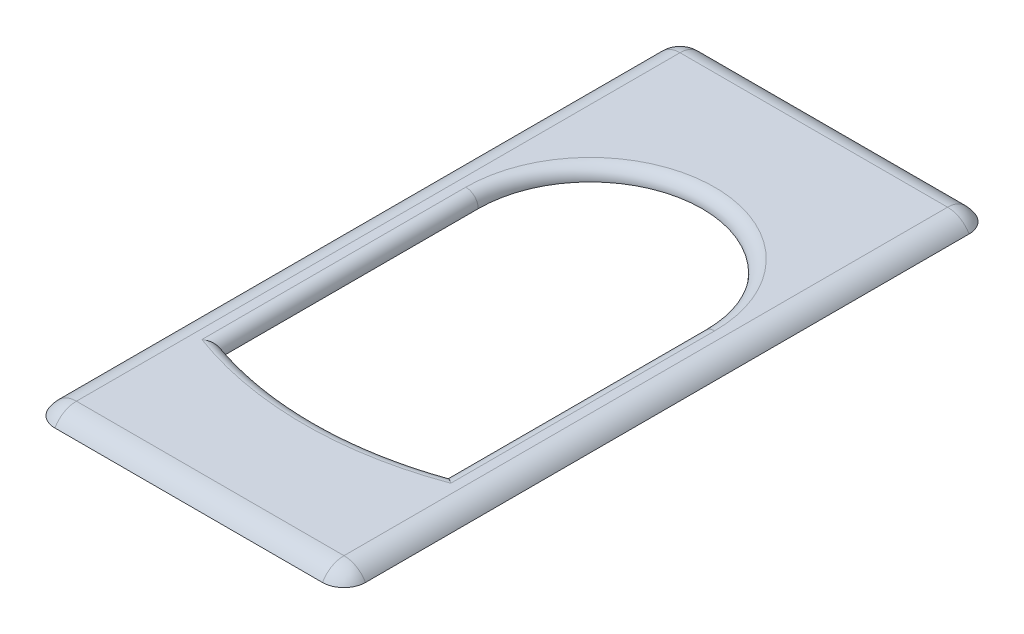
ISO-10303-21;
HEADER;
FILE_DESCRIPTION(('STEP AP214'),'2;1');
FILE_NAME('part.step','',(''),(''),'','','');
FILE_SCHEMA(('AUTOMOTIVE_DESIGN { 1 0 10303 214 1 1 1 1 }'));
ENDSEC;
DATA;
#1=APPLICATION_CONTEXT('core data for automotive mechanical design processes');
#2=APPLICATION_PROTOCOL_DEFINITION('international standard','automotive_design',2000,#1);
#3=PRODUCT_CONTEXT('',#1,'mechanical');
#4=PRODUCT('Part','Part','',(#3));
#5=PRODUCT_RELATED_PRODUCT_CATEGORY('part','',(#4));
#6=PRODUCT_DEFINITION_FORMATION('','',#4);
#7=PRODUCT_DEFINITION_CONTEXT('part definition',#1,'design');
#8=PRODUCT_DEFINITION('design','',#6,#7);
#9=PRODUCT_DEFINITION_SHAPE('','',#8);
#10=(LENGTH_UNIT() NAMED_UNIT(*) SI_UNIT(.MILLI.,.METRE.));
#11=(NAMED_UNIT(*) PLANE_ANGLE_UNIT() SI_UNIT($,.RADIAN.));
#12=(NAMED_UNIT(*) SI_UNIT($,.STERADIAN.) SOLID_ANGLE_UNIT());
#13=UNCERTAINTY_MEASURE_WITH_UNIT(LENGTH_MEASURE(1.E-05),#10,'distance_accuracy_value','');
#14=(GEOMETRIC_REPRESENTATION_CONTEXT(3) GLOBAL_UNCERTAINTY_ASSIGNED_CONTEXT((#13)) GLOBAL_UNIT_ASSIGNED_CONTEXT((#10,
#11,#12)) REPRESENTATION_CONTEXT('',''));
#15=CARTESIAN_POINT('',(0.,0.,0.));
#16=DIRECTION('',(0.,0.,1.));
#17=DIRECTION('',(1.,0.,0.));
#18=AXIS2_PLACEMENT_3D('',#15,#16,#17);
#19=CARTESIAN_POINT('',(-8.35943293347874,2.,-34.0991604019739));
#20=DIRECTION('',(0.,1.,0.));
#21=DIRECTION('',(0.,0.,1.));
#22=AXIS2_PLACEMENT_3D('',#19,#20,#21);
#23=PLANE('',#22);
#24=CARTESIAN_POINT('',(2.39056706652126,2.,-16.1368047982552));
#25=DIRECTION('',(0.,1.,0.));
#26=DIRECTION('',(0.,0.,1.));
#27=AXIS2_PLACEMENT_3D('',#24,#25,#26);
#28=CIRCLE('',#27,10.);
#29=CARTESIAN_POINT('',(-7.60943293347874,2.,-16.1368047982552));
#30=VERTEX_POINT('',#29);
#31=CARTESIAN_POINT('',(12.3905670665213,2.,-16.1368047982552));
#32=VERTEX_POINT('',#31);
#33=EDGE_CURVE('E54',#30,#32,#28,.F.);
#34=ORIENTED_EDGE('',*,*,#33,.T.);
#35=DIRECTION('',(0.,0.,-1.));
#36=VECTOR('',#35,1.);
#37=CARTESIAN_POINT('',(12.3905670665212,2.,-34.0991604019739));
#38=LINE('',#37,#36);
#39=CARTESIAN_POINT('',(12.3905670665213,2.,5.0680185178046));
#40=VERTEX_POINT('',#39);
#41=EDGE_CURVE('E11',#32,#40,#38,.F.);
#42=ORIENTED_EDGE('',*,*,#41,.T.);
#43=CARTESIAN_POINT('',(2.39056706652126,2.,-21.8868047982555));
#44=DIRECTION('',(0.,1.,0.));
#45=DIRECTION('',(0.,0.,1.));
#46=AXIS2_PLACEMENT_3D('',#43,#44,#45);
#47=CIRCLE('',#46,28.7500000000003);
#48=CARTESIAN_POINT('',(-7.60943293347874,2.,5.0680185178046));
#49=VERTEX_POINT('',#48);
#50=EDGE_CURVE('E132',#40,#49,#47,.F.);
#51=ORIENTED_EDGE('',*,*,#50,.T.);
#52=DIRECTION('',(0.,0.,1.));
#53=VECTOR('',#52,1.);
#54=CARTESIAN_POINT('',(-7.60943293347874,2.,-34.0991604019739));
#55=LINE('',#54,#53);
#56=EDGE_CURVE('E65',#49,#30,#55,.F.);
#57=ORIENTED_EDGE('',*,*,#56,.T.);
#58=EDGE_LOOP('',(#34,#42,#51,#57));
#59=FACE_BOUND('',#58,.T.);
#60=DIRECTION('',(0.,0.,1.));
#61=VECTOR('',#60,1.);
#62=CARTESIAN_POINT('',(-8.35943293347874,2.,14.4008395980261));
#63=LINE('',#62,#61);
#64=CARTESIAN_POINT('',(-8.35943293347874,2.,-34.0991604019739));
#65=VERTEX_POINT('',#64);
#66=CARTESIAN_POINT('',(-8.35943293347874,2.,14.4008395980261));
#67=VERTEX_POINT('',#66);
#68=EDGE_CURVE('E175',#65,#67,#63,.T.);
#69=ORIENTED_EDGE('',*,*,#68,.T.);
#70=DIRECTION('',(1.,0.,0.));
#71=VECTOR('',#70,1.);
#72=CARTESIAN_POINT('',(13.1405670665213,2.,14.4008395980261));
#73=LINE('',#72,#71);
#74=CARTESIAN_POINT('',(13.1405670665213,2.,14.4008395980261));
#75=VERTEX_POINT('',#74);
#76=EDGE_CURVE('E133',#67,#75,#73,.T.);
#77=ORIENTED_EDGE('',*,*,#76,.T.);
#78=DIRECTION('',(0.,0.,-1.));
#79=VECTOR('',#78,1.);
#80=CARTESIAN_POINT('',(13.1405670665213,2.,-34.0991604019739));
#81=LINE('',#80,#79);
#82=CARTESIAN_POINT('',(13.1405670665213,2.,-34.0991604019739));
#83=VERTEX_POINT('',#82);
#84=EDGE_CURVE('E261',#75,#83,#81,.T.);
#85=ORIENTED_EDGE('',*,*,#84,.T.);
#86=DIRECTION('',(-1.,0.,0.));
#87=VECTOR('',#86,1.);
#88=CARTESIAN_POINT('',(-8.35943293347874,2.,-34.0991604019739));
#89=LINE('',#88,#87);
#90=EDGE_CURVE('E258',#83,#65,#89,.T.);
#91=ORIENTED_EDGE('',*,*,#90,.T.);
#92=EDGE_LOOP('',(#69,#77,#85,#91));
#93=FACE_BOUND('',#92,.T.);
#94=ADVANCED_FACE('F38',(#59,#93),#23,.T.);
#95=CARTESIAN_POINT('',(13.1405670665213,0.,-34.0991604019739));
#96=DIRECTION('',(0.,1.,0.));
#97=DIRECTION('',(0.,0.,1.));
#98=AXIS2_PLACEMENT_3D('',#95,#96,#97);
#99=SPHERICAL_SURFACE('',#98,2.);
#100=CARTESIAN_POINT('',(13.1405670665213,1.,-34.0991604019739));
#101=DIRECTION('',(0.,1.,0.));
#102=DIRECTION('',(0.,0.,1.));
#103=AXIS2_PLACEMENT_3D('',#100,#101,#102);
#104=CIRCLE('',#103,1.73205080756888);
#105=CARTESIAN_POINT('',(13.1405670665213,1.,-35.8312112095427));
#106=VERTEX_POINT('',#105);
#107=CARTESIAN_POINT('',(14.8726178740901,1.,-34.0991604019739));
#108=VERTEX_POINT('',#107);
#109=EDGE_CURVE('E251',#106,#108,#104,.F.);
#110=ORIENTED_EDGE('',*,*,#109,.F.);
#111=CARTESIAN_POINT('',(13.1405670665213,0.,-34.0991604019739));
#112=DIRECTION('',(-1.,0.,0.));
#113=DIRECTION('',(0.,0.,1.));
#114=AXIS2_PLACEMENT_3D('',#111,#112,#113);
#115=CIRCLE('',#114,2.);
#116=EDGE_CURVE('E172',#83,#106,#115,.T.);
#117=ORIENTED_EDGE('',*,*,#116,.F.);
#118=CARTESIAN_POINT('',(13.1405670665213,0.,-34.0991604019739));
#119=DIRECTION('',(0.,0.,1.));
#120=DIRECTION('',(1.,0.,0.));
#121=AXIS2_PLACEMENT_3D('',#118,#119,#120);
#122=CIRCLE('',#121,2.);
#123=EDGE_CURVE('E169',#108,#83,#122,.T.);
#124=ORIENTED_EDGE('',*,*,#123,.F.);
#125=EDGE_LOOP('',(#110,#117,#124));
#126=FACE_BOUND('',#125,.T.);
#127=ADVANCED_FACE('F210',(#126),#99,.T.);
#128=CARTESIAN_POINT('',(-8.35943293347874,0.,-34.0991604019739));
#129=DIRECTION('',(1.,0.,0.));
#130=DIRECTION('',(0.,0.,-1.));
#131=AXIS2_PLACEMENT_3D('',#128,#129,#130);
#132=CYLINDRICAL_SURFACE('',#131,2.);
#133=DIRECTION('',(1.,0.,0.));
#134=VECTOR('',#133,1.);
#135=CARTESIAN_POINT('',(-8.35943293347874,1.,-35.8312112095427));
#136=LINE('',#135,#134);
#137=CARTESIAN_POINT('',(-8.35943293347874,1.,-35.8312112095427));
#138=VERTEX_POINT('',#137);
#139=EDGE_CURVE('E246',#138,#106,#136,.T.);
#140=ORIENTED_EDGE('',*,*,#139,.F.);
#141=CARTESIAN_POINT('',(-8.35943293347874,0.,-34.0991604019739));
#142=DIRECTION('',(-1.,0.,0.));
#143=DIRECTION('',(0.,0.,1.));
#144=AXIS2_PLACEMENT_3D('',#141,#142,#143);
#145=CIRCLE('',#144,2.);
#146=EDGE_CURVE('E165',#65,#138,#145,.T.);
#147=ORIENTED_EDGE('',*,*,#146,.F.);
#148=ORIENTED_EDGE('',*,*,#90,.F.);
#149=ORIENTED_EDGE('',*,*,#116,.T.);
#150=EDGE_LOOP('',(#140,#147,#148,#149));
#151=FACE_BOUND('',#150,.T.);
#152=ADVANCED_FACE('F215',(#151),#132,.T.);
#153=CARTESIAN_POINT('',(13.1405670665213,0.,-34.0991604019739));
#154=DIRECTION('',(0.,0.,1.));
#155=DIRECTION('',(1.,0.,0.));
#156=AXIS2_PLACEMENT_3D('',#153,#154,#155);
#157=CYLINDRICAL_SURFACE('',#156,2.);
#158=DIRECTION('',(0.,0.,1.));
#159=VECTOR('',#158,1.);
#160=CARTESIAN_POINT('',(14.8726178740901,1.,-34.0991604019739));
#161=LINE('',#160,#159);
#162=CARTESIAN_POINT('',(14.8726178740901,1.,14.4008395980261));
#163=VERTEX_POINT('',#162);
#164=EDGE_CURVE('E252',#108,#163,#161,.T.);
#165=ORIENTED_EDGE('',*,*,#164,.F.);
#166=ORIENTED_EDGE('',*,*,#123,.T.);
#167=ORIENTED_EDGE('',*,*,#84,.F.);
#168=CARTESIAN_POINT('',(13.1405670665213,0.,14.4008395980261));
#169=DIRECTION('',(0.,0.,1.));
#170=DIRECTION('',(1.,0.,0.));
#171=AXIS2_PLACEMENT_3D('',#168,#169,#170);
#172=CIRCLE('',#171,2.);
#173=EDGE_CURVE('E162',#163,#75,#172,.T.);
#174=ORIENTED_EDGE('',*,*,#173,.F.);
#175=EDGE_LOOP('',(#165,#166,#167,#174));
#176=FACE_BOUND('',#175,.T.);
#177=ADVANCED_FACE('F235',(#176),#157,.T.);
#178=CARTESIAN_POINT('',(-8.35943293347874,0.,-34.0991604019739));
#179=DIRECTION('',(0.,1.,0.));
#180=DIRECTION('',(0.,0.,1.));
#181=AXIS2_PLACEMENT_3D('',#178,#179,#180);
#182=SPHERICAL_SURFACE('',#181,2.);
#183=CARTESIAN_POINT('',(-8.35943293347874,1.,-34.0991604019739));
#184=DIRECTION('',(0.,1.,0.));
#185=DIRECTION('',(0.,0.,1.));
#186=AXIS2_PLACEMENT_3D('',#183,#184,#185);
#187=CIRCLE('',#186,1.73205080756888);
#188=CARTESIAN_POINT('',(-10.0914837410476,1.,-34.0991604019739));
#189=VERTEX_POINT('',#188);
#190=EDGE_CURVE('E254',#189,#138,#187,.F.);
#191=ORIENTED_EDGE('',*,*,#190,.F.);
#192=CARTESIAN_POINT('',(-8.35943293347874,0.,-34.0991604019739));
#193=DIRECTION('',(0.,0.,1.));
#194=DIRECTION('',(1.,0.,0.));
#195=AXIS2_PLACEMENT_3D('',#192,#193,#194);
#196=CIRCLE('',#195,2.);
#197=EDGE_CURVE('E142',#65,#189,#196,.T.);
#198=ORIENTED_EDGE('',*,*,#197,.F.);
#199=ORIENTED_EDGE('',*,*,#146,.T.);
#200=EDGE_LOOP('',(#191,#198,#199));
#201=FACE_BOUND('',#200,.T.);
#202=ADVANCED_FACE('F231',(#201),#182,.T.);
#203=CARTESIAN_POINT('',(13.1405670665213,0.,14.4008395980261));
#204=DIRECTION('',(0.,1.,0.));
#205=DIRECTION('',(0.,0.,1.));
#206=AXIS2_PLACEMENT_3D('',#203,#204,#205);
#207=SPHERICAL_SURFACE('',#206,2.);
#208=CARTESIAN_POINT('',(13.1405670665213,1.,14.4008395980261));
#209=DIRECTION('',(0.,1.,0.));
#210=DIRECTION('',(0.,0.,1.));
#211=AXIS2_PLACEMENT_3D('',#208,#209,#210);
#212=CIRCLE('',#211,1.73205080756888);
#213=CARTESIAN_POINT('',(13.1405670665213,1.,16.132890405595));
#214=VERTEX_POINT('',#213);
#215=EDGE_CURVE('E144',#163,#214,#212,.F.);
#216=ORIENTED_EDGE('',*,*,#215,.F.);
#217=ORIENTED_EDGE('',*,*,#173,.T.);
#218=CARTESIAN_POINT('',(13.1405670665213,0.,14.4008395980261));
#219=DIRECTION('',(-1.,0.,0.));
#220=DIRECTION('',(0.,0.,1.));
#221=AXIS2_PLACEMENT_3D('',#218,#219,#220);
#222=CIRCLE('',#221,2.);
#223=EDGE_CURVE('E150',#214,#75,#222,.T.);
#224=ORIENTED_EDGE('',*,*,#223,.F.);
#225=EDGE_LOOP('',(#216,#217,#224));
#226=FACE_BOUND('',#225,.T.);
#227=ADVANCED_FACE('F228',(#226),#207,.T.);
#228=CARTESIAN_POINT('',(-8.35943293347874,0.,-34.0991604019739));
#229=DIRECTION('',(0.,0.,-1.));
#230=DIRECTION('',(-1.,0.,0.));
#231=AXIS2_PLACEMENT_3D('',#228,#229,#230);
#232=CYLINDRICAL_SURFACE('',#231,2.);
#233=DIRECTION('',(0.,0.,-1.));
#234=VECTOR('',#233,1.);
#235=CARTESIAN_POINT('',(-10.0914837410476,1.,-34.0991604019739));
#236=LINE('',#235,#234);
#237=CARTESIAN_POINT('',(-10.0914837410476,1.,14.4008395980261));
#238=VERTEX_POINT('',#237);
#239=EDGE_CURVE('E124',#238,#189,#236,.T.);
#240=ORIENTED_EDGE('',*,*,#239,.F.);
#241=CARTESIAN_POINT('',(-8.35943293347874,0.,14.4008395980261));
#242=DIRECTION('',(0.,0.,1.));
#243=DIRECTION('',(1.,0.,0.));
#244=AXIS2_PLACEMENT_3D('',#241,#242,#243);
#245=CIRCLE('',#244,2.);
#246=EDGE_CURVE('E140',#67,#238,#245,.T.);
#247=ORIENTED_EDGE('',*,*,#246,.F.);
#248=ORIENTED_EDGE('',*,*,#68,.F.);
#249=ORIENTED_EDGE('',*,*,#197,.T.);
#250=EDGE_LOOP('',(#240,#247,#248,#249));
#251=FACE_BOUND('',#250,.T.);
#252=ADVANCED_FACE('F138',(#251),#232,.T.);
#253=CARTESIAN_POINT('',(-8.35943293347873,0.,14.4008395980261));
#254=DIRECTION('',(-1.,0.,0.));
#255=DIRECTION('',(0.,0.,1.));
#256=AXIS2_PLACEMENT_3D('',#253,#254,#255);
#257=CYLINDRICAL_SURFACE('',#256,2.);
#258=DIRECTION('',(-1.,0.,0.));
#259=VECTOR('',#258,1.);
#260=CARTESIAN_POINT('',(-8.35943293347873,1.,16.132890405595));
#261=LINE('',#260,#259);
#262=CARTESIAN_POINT('',(-8.35943293347875,1.,16.132890405595));
#263=VERTEX_POINT('',#262);
#264=EDGE_CURVE('E127',#214,#263,#261,.T.);
#265=ORIENTED_EDGE('',*,*,#264,.F.);
#266=ORIENTED_EDGE('',*,*,#223,.T.);
#267=ORIENTED_EDGE('',*,*,#76,.F.);
#268=CARTESIAN_POINT('',(-8.35943293347875,0.,14.4008395980261));
#269=DIRECTION('',(-1.,0.,0.));
#270=DIRECTION('',(0.,0.,1.));
#271=AXIS2_PLACEMENT_3D('',#268,#269,#270);
#272=CIRCLE('',#271,2.);
#273=EDGE_CURVE('E147',#263,#67,#272,.T.);
#274=ORIENTED_EDGE('',*,*,#273,.F.);
#275=EDGE_LOOP('',(#265,#266,#267,#274));
#276=FACE_BOUND('',#275,.T.);
#277=ADVANCED_FACE('F222',(#276),#257,.T.);
#278=CARTESIAN_POINT('',(-8.35943293347875,0.,14.4008395980261));
#279=DIRECTION('',(0.,1.,0.));
#280=DIRECTION('',(0.,0.,1.));
#281=AXIS2_PLACEMENT_3D('',#278,#279,#280);
#282=SPHERICAL_SURFACE('',#281,2.);
#283=CARTESIAN_POINT('',(-8.35943293347875,1.,14.4008395980261));
#284=DIRECTION('',(0.,1.,0.));
#285=DIRECTION('',(0.,0.,1.));
#286=AXIS2_PLACEMENT_3D('',#283,#284,#285);
#287=CIRCLE('',#286,1.73205080756888);
#288=EDGE_CURVE('E121',#263,#238,#287,.F.);
#289=ORIENTED_EDGE('',*,*,#288,.F.);
#290=ORIENTED_EDGE('',*,*,#273,.T.);
#291=ORIENTED_EDGE('',*,*,#246,.T.);
#292=EDGE_LOOP('',(#289,#290,#291));
#293=FACE_BOUND('',#292,.T.);
#294=ADVANCED_FACE('F146',(#293),#282,.T.);
#295=CARTESIAN_POINT('',(0.,1.,0.));
#296=DIRECTION('',(0.,1.,0.));
#297=DIRECTION('',(0.,0.,1.));
#298=AXIS2_PLACEMENT_3D('',#295,#296,#297);
#299=PLANE('',#298);
#300=CARTESIAN_POINT('',(2.39056706652126,1.,-16.1368047982552));
#301=DIRECTION('',(0.,1.,0.));
#302=DIRECTION('',(0.,0.,1.));
#303=AXIS2_PLACEMENT_3D('',#300,#301,#302);
#304=CIRCLE('',#303,9.);
#305=CARTESIAN_POINT('',(11.3905670665213,1.,-16.1368047982552));
#306=VERTEX_POINT('',#305);
#307=CARTESIAN_POINT('',(-6.60943293347874,1.,-16.1368047982552));
#308=VERTEX_POINT('',#307);
#309=EDGE_CURVE('E156',#306,#308,#304,.T.);
#310=ORIENTED_EDGE('',*,*,#309,.T.);
#311=DIRECTION('',(0.,0.,1.));
#312=VECTOR('',#311,1.);
#313=CARTESIAN_POINT('',(-6.60943293347874,1.,-16.1368047982552));
#314=LINE('',#313,#312);
#315=CARTESIAN_POINT('',(-6.60943293347874,1.,4.36319520174482));
#316=VERTEX_POINT('',#315);
#317=EDGE_CURVE('E285',#308,#316,#314,.T.);
#318=ORIENTED_EDGE('',*,*,#317,.T.);
#319=CARTESIAN_POINT('',(2.39056706652126,1.,-21.8868047982555));
#320=DIRECTION('',(0.,1.,0.));
#321=DIRECTION('',(0.,0.,1.));
#322=AXIS2_PLACEMENT_3D('',#319,#320,#321);
#323=CIRCLE('',#322,27.7500000000003);
#324=CARTESIAN_POINT('',(11.3905670665213,1.,4.36319520174482));
#325=VERTEX_POINT('',#324);
#326=EDGE_CURVE('E280',#316,#325,#323,.T.);
#327=ORIENTED_EDGE('',*,*,#326,.T.);
#328=DIRECTION('',(0.,0.,-1.));
#329=VECTOR('',#328,1.);
#330=CARTESIAN_POINT('',(11.3905670665213,1.,-16.1368047982552));
#331=LINE('',#330,#329);
#332=EDGE_CURVE('E276',#325,#306,#331,.T.);
#333=ORIENTED_EDGE('',*,*,#332,.T.);
#334=EDGE_LOOP('',(#310,#318,#327,#333));
#335=FACE_BOUND('',#334,.T.);
#336=ORIENTED_EDGE('',*,*,#109,.T.);
#337=ORIENTED_EDGE('',*,*,#164,.T.);
#338=ORIENTED_EDGE('',*,*,#215,.T.);
#339=ORIENTED_EDGE('',*,*,#264,.T.);
#340=ORIENTED_EDGE('',*,*,#288,.T.);
#341=ORIENTED_EDGE('',*,*,#239,.T.);
#342=ORIENTED_EDGE('',*,*,#190,.T.);
#343=ORIENTED_EDGE('',*,*,#139,.T.);
#344=EDGE_LOOP('',(#336,#337,#338,#339,#340,#341,#342,#343));
#345=FACE_BOUND('',#344,.T.);
#346=ADVANCED_FACE('F123',(#335,#345),#299,.F.);
#347=CARTESIAN_POINT('',(-7.60943293347874,1.,-16.1368047982552));
#348=DIRECTION('',(0.,0.,1.));
#349=DIRECTION('',(1.,0.,0.));
#350=AXIS2_PLACEMENT_3D('',#347,#348,#349);
#351=CYLINDRICAL_SURFACE('',#350,1.);
#352=CARTESIAN_POINT('',(-7.60943293347874,1.,-16.1368047982552));
#353=DIRECTION('',(0.,0.,-1.));
#354=DIRECTION('',(-1.,0.,0.));
#355=AXIS2_PLACEMENT_3D('',#352,#353,#354);
#356=CIRCLE('',#355,1.);
#357=EDGE_CURVE('E193',#30,#308,#356,.T.);
#358=ORIENTED_EDGE('',*,*,#357,.F.);
#359=ORIENTED_EDGE('',*,*,#56,.F.);
#360=CARTESIAN_POINT('',(-6.60943293347874,1.,4.36319520174482));
#361=CARTESIAN_POINT('',(-6.60943085809779,1.02444652383991,4.36319364130846));
#362=CARTESIAN_POINT('',(-6.6103301041468,1.04887961209092,4.3638360447473));
#363=CARTESIAN_POINT('',(-6.61390249222355,1.09753799710753,4.36638759696495));
#364=CARTESIAN_POINT('',(-6.61657480858752,1.1217633852765,4.3682961561343));
#365=CARTESIAN_POINT('',(-6.62716378897788,1.19358067302208,4.37585755169182));
#366=CARTESIAN_POINT('',(-6.63765333362022,1.24063351731015,4.38334672843277));
#367=CARTESIAN_POINT('',(-6.6648803070119,1.3317918364809,4.40277239420937));
#368=CARTESIAN_POINT('',(-6.68160861534007,1.37590150355055,4.41470239118147));
#369=CARTESIAN_POINT('',(-6.72050024264562,1.46039627680851,4.44241311048428));
#370=CARTESIAN_POINT('',(-6.7426703346487,1.50077665453437,4.45819863140705));
#371=CARTESIAN_POINT('',(-6.79321003047789,1.57976465002596,4.49414447678721));
#372=CARTESIAN_POINT('',(-6.82189937411691,1.61806342857582,4.51452977664751));
#373=CARTESIAN_POINT('',(-6.88341155374673,1.68928176198222,4.55817913220819));
#374=CARTESIAN_POINT('',(-6.91623504890171,1.72220045709131,4.58144364697076));
#375=CARTESIAN_POINT('',(-6.99124738634925,1.78787882328514,4.6345330979837));
#376=CARTESIAN_POINT('',(-7.03406417039577,1.81957176715564,4.6647893367768));
#377=CARTESIAN_POINT('',(-7.12299710307447,1.87529430970054,4.7275173618221));
#378=CARTESIAN_POINT('',(-7.16911816724044,1.89931218827833,4.75999244541616));
#379=CARTESIAN_POINT('',(-7.27846574350078,1.94605648335834,4.83683883473047));
#380=CARTESIAN_POINT('',(-7.34251243899344,1.9660043814039,4.88174107911874));
#381=CARTESIAN_POINT('',(-7.47241119012579,1.99277858397102,4.97257425308607));
#382=CARTESIAN_POINT('',(-7.53825912805896,1.99963263225601,5.01850279858145));
#383=CARTESIAN_POINT('',(-7.60585833307112,1.99999521137748,5.06553191079891));
#384=CARTESIAN_POINT('',(-7.60764565663399,2.00000000304552,5.06677527404471));
#385=CARTESIAN_POINT('',(-7.60943293347874,2.,5.0680185178046));
#386=B_SPLINE_CURVE_WITH_KNOTS('',3,(#360,#361,#362,#363,#364,#365,#366,#367,#368,#369,#370,
#371,#372,#373,#374,#375,#376,#377,#378,#379,#380,#381,#382,#383,#384,#385),.UNSPECIFIED.,.F.,
.F.,(4,2,2,2,2,2,2,2,2,2,2,2,4),(0.,0.0732887124091716,0.146543320471394,0.292106756075444,
0.437458221994248,0.582991522790636,0.738452556367372,0.893938408670392,1.07704079120754,
1.26042145606028,1.50143886573018,1.74194502937055,1.74847681206028),.UNSPECIFIED.);
#387=EDGE_CURVE('E43',#316,#49,#386,.T.);
#388=ORIENTED_EDGE('',*,*,#387,.F.);
#389=ORIENTED_EDGE('',*,*,#317,.F.);
#390=EDGE_LOOP('',(#358,#359,#388,#389));
#391=FACE_BOUND('',#390,.T.);
#392=ADVANCED_FACE('F40',(#391),#351,.T.);
#393=CARTESIAN_POINT('',(2.39056706652126,1.,-21.8868047982555));
#394=DIRECTION('',(0.,1.,0.));
#395=DIRECTION('',(0.,0.,1.));
#396=AXIS2_PLACEMENT_3D('',#393,#394,#395);
#397=TOROIDAL_SURFACE('',#396,28.7500000000003,1.);
#398=ORIENTED_EDGE('',*,*,#387,.T.);
#399=ORIENTED_EDGE('',*,*,#50,.F.);
#400=CARTESIAN_POINT('',(11.3905670665213,1.,4.36319520174482));
#401=CARTESIAN_POINT('',(11.3905649911403,1.02444652383991,4.36319364130846));
#402=CARTESIAN_POINT('',(11.3914642371893,1.04887961209092,4.36383604474729));
#403=CARTESIAN_POINT('',(11.3950366252661,1.09753799710753,4.36638759696494));
#404=CARTESIAN_POINT('',(11.39770894163,1.1217633852765,4.3682961561343));
#405=CARTESIAN_POINT('',(11.4082979220204,1.19358067302208,4.37585755169182));
#406=CARTESIAN_POINT('',(11.4187874666627,1.24063351731015,4.38334672843277));
#407=CARTESIAN_POINT('',(11.4460144400544,1.3317918364809,4.40277239420938));
#408=CARTESIAN_POINT('',(11.4627427483826,1.37590150355056,4.41470239118147));
#409=CARTESIAN_POINT('',(11.5016343756881,1.46039627680851,4.44241311048428));
#410=CARTESIAN_POINT('',(11.5238044676912,1.50077665453437,4.45819863140705));
#411=CARTESIAN_POINT('',(11.5743441635204,1.57976465002596,4.49414447678721));
#412=CARTESIAN_POINT('',(11.6030335071594,1.61806342857582,4.51452977664751));
#413=CARTESIAN_POINT('',(11.6645456867892,1.68928176198222,4.55817913220819));
#414=CARTESIAN_POINT('',(11.6973691819442,1.72220045709131,4.58144364697076));
#415=CARTESIAN_POINT('',(11.7723815193918,1.78787882328514,4.6345330979837));
#416=CARTESIAN_POINT('',(11.8151983034383,1.81957176715564,4.6647893367768));
#417=CARTESIAN_POINT('',(11.904131236117,1.87529430970054,4.72751736182211));
#418=CARTESIAN_POINT('',(11.9502523002829,1.89931218827833,4.75999244541618));
#419=CARTESIAN_POINT('',(12.0595998765433,1.94605648335834,4.83683883473045));
#420=CARTESIAN_POINT('',(12.123646572036,1.9660043814039,4.88174107911864));
#421=CARTESIAN_POINT('',(12.2535453231682,1.99277858397102,4.97257425308618));
#422=CARTESIAN_POINT('',(12.3193932611012,1.99963263225601,5.01850279858184));
#423=CARTESIAN_POINT('',(12.3869924661136,1.99999521137748,5.06553191079893));
#424=CARTESIAN_POINT('',(12.3887797896765,2.00000000304553,5.06677527404473));
#425=CARTESIAN_POINT('',(12.3905670665213,2.,5.0680185178046));
#426=B_SPLINE_CURVE_WITH_KNOTS('',3,(#400,#401,#402,#403,#404,#405,#406,#407,#408,#409,#410,
#411,#412,#413,#414,#415,#416,#417,#418,#419,#420,#421,#422,#423,#424,#425),.UNSPECIFIED.,.F.,
.F.,(4,2,2,2,2,2,2,2,2,2,2,2,4),(0.,0.0732887124091719,0.146543320471394,0.292106756075445,
0.437458221994249,0.582991522790637,0.738452556367374,0.893938408670393,1.07704079120754,
1.26042145606028,1.50143886573018,1.74194502937056,1.74847681206028),.UNSPECIFIED.);
#427=EDGE_CURVE('E186',#325,#40,#426,.T.);
#428=ORIENTED_EDGE('',*,*,#427,.F.);
#429=ORIENTED_EDGE('',*,*,#326,.F.);
#430=EDGE_LOOP('',(#398,#399,#428,#429));
#431=FACE_BOUND('',#430,.T.);
#432=ADVANCED_FACE('F194',(#431),#397,.T.);
#433=CARTESIAN_POINT('',(2.39056706652126,1.,-16.1368047982552));
#434=DIRECTION('',(0.,1.,0.));
#435=DIRECTION('',(0.,0.,1.));
#436=AXIS2_PLACEMENT_3D('',#433,#434,#435);
#437=TOROIDAL_SURFACE('',#436,10.,1.);
#438=ORIENTED_EDGE('',*,*,#357,.T.);
#439=ORIENTED_EDGE('',*,*,#309,.F.);
#440=CARTESIAN_POINT('',(12.3905670665213,1.,-16.1368047982552));
#441=DIRECTION('',(0.,0.,1.));
#442=DIRECTION('',(1.,0.,0.));
#443=AXIS2_PLACEMENT_3D('',#440,#441,#442);
#444=CIRCLE('',#443,1.);
#445=EDGE_CURVE('E183',#32,#306,#444,.T.);
#446=ORIENTED_EDGE('',*,*,#445,.F.);
#447=ORIENTED_EDGE('',*,*,#33,.F.);
#448=EDGE_LOOP('',(#438,#439,#446,#447));
#449=FACE_BOUND('',#448,.T.);
#450=ADVANCED_FACE('F200',(#449),#437,.T.);
#451=CARTESIAN_POINT('',(12.3905670665213,1.,-16.1368047982552));
#452=DIRECTION('',(0.,0.,-1.));
#453=DIRECTION('',(-1.,0.,0.));
#454=AXIS2_PLACEMENT_3D('',#451,#452,#453);
#455=CYLINDRICAL_SURFACE('',#454,1.);
#456=ORIENTED_EDGE('',*,*,#427,.T.);
#457=ORIENTED_EDGE('',*,*,#41,.F.);
#458=ORIENTED_EDGE('',*,*,#445,.T.);
#459=ORIENTED_EDGE('',*,*,#332,.F.);
#460=EDGE_LOOP('',(#456,#457,#458,#459));
#461=FACE_BOUND('',#460,.T.);
#462=ADVANCED_FACE('F197',(#461),#455,.T.);
#463=CLOSED_SHELL('',(#94,#127,#152,#177,#202,#227,#252,#277,#294,#346,#392,#432,#450,#462));
#464=MANIFOLD_SOLID_BREP('B2',#463);
#465=ADVANCED_BREP_SHAPE_REPRESENTATION('',(#18,#464),#14);
#466=SHAPE_DEFINITION_REPRESENTATION(#9,#465);
ENDSEC;
END-ISO-10303-21;
